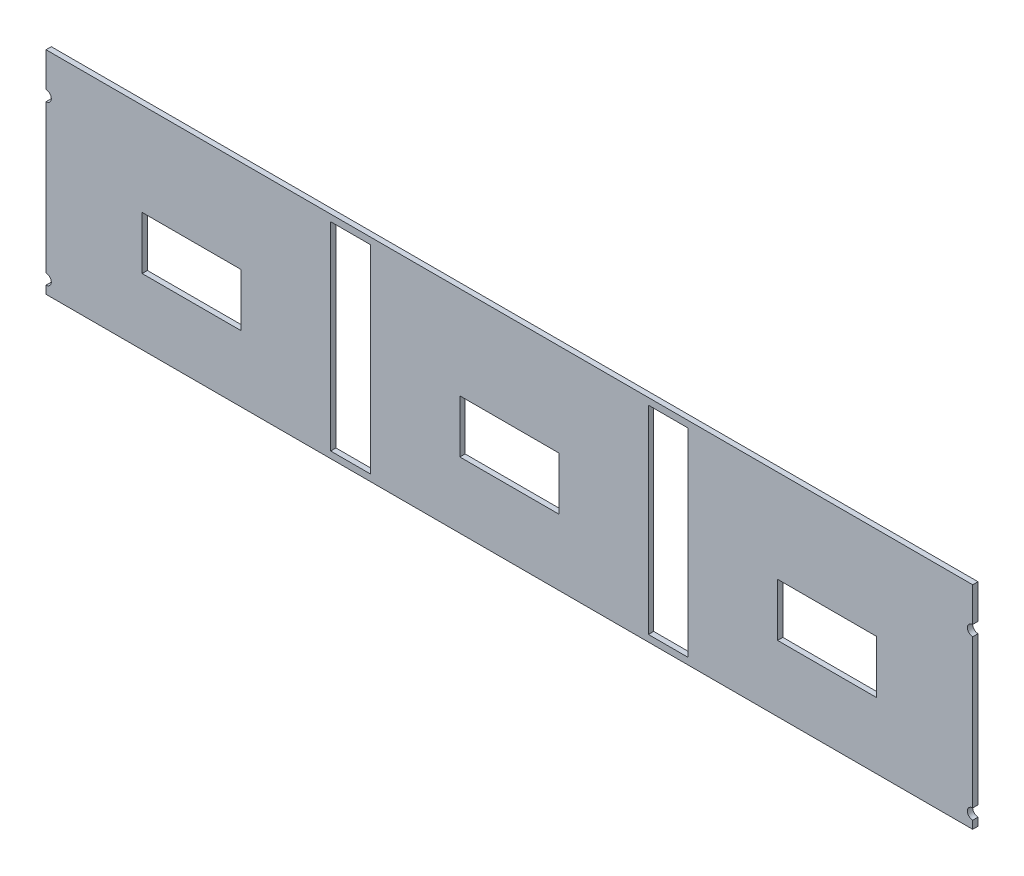
ISO-10303-21;
HEADER;
FILE_DESCRIPTION(('STEP AP214'),'2;1');
FILE_NAME('part.step','',(''),(''),'','','');
FILE_SCHEMA(('AUTOMOTIVE_DESIGN { 1 0 10303 214 1 1 1 1 }'));
ENDSEC;
DATA;
#1=APPLICATION_CONTEXT('core data for automotive mechanical design processes');
#2=APPLICATION_PROTOCOL_DEFINITION('international standard','automotive_design',2000,#1);
#3=PRODUCT_CONTEXT('',#1,'mechanical');
#4=PRODUCT('Part','Part','',(#3));
#5=PRODUCT_RELATED_PRODUCT_CATEGORY('part','',(#4));
#6=PRODUCT_DEFINITION_FORMATION('','',#4);
#7=PRODUCT_DEFINITION_CONTEXT('part definition',#1,'design');
#8=PRODUCT_DEFINITION('design','',#6,#7);
#9=PRODUCT_DEFINITION_SHAPE('','',#8);
#10=(LENGTH_UNIT() NAMED_UNIT(*) SI_UNIT(.MILLI.,.METRE.));
#11=(NAMED_UNIT(*) PLANE_ANGLE_UNIT() SI_UNIT($,.RADIAN.));
#12=(NAMED_UNIT(*) SI_UNIT($,.STERADIAN.) SOLID_ANGLE_UNIT());
#13=UNCERTAINTY_MEASURE_WITH_UNIT(LENGTH_MEASURE(1.E-05),#10,'distance_accuracy_value','');
#14=(GEOMETRIC_REPRESENTATION_CONTEXT(3) GLOBAL_UNCERTAINTY_ASSIGNED_CONTEXT((#13)) GLOBAL_UNIT_ASSIGNED_CONTEXT((#10,
#11,#12)) REPRESENTATION_CONTEXT('',''));
#15=CARTESIAN_POINT('',(0.,0.,0.));
#16=DIRECTION('',(0.,0.,1.));
#17=DIRECTION('',(1.,0.,0.));
#18=AXIS2_PLACEMENT_3D('',#15,#16,#17);
#19=CARTESIAN_POINT('',(-140.25891639578,36.8516824612227,2.54));
#20=DIRECTION('',(0.,1.,0.));
#21=DIRECTION('',(-1.,0.,0.));
#22=AXIS2_PLACEMENT_3D('',#19,#20,#21);
#23=PLANE('',#22);
#24=DIRECTION('',(1.,0.,0.));
#25=VECTOR('',#24,1.);
#26=CARTESIAN_POINT('',(-140.25891639578,36.8516824612227,0.));
#27=LINE('',#26,#25);
#28=CARTESIAN_POINT('',(-11.6079163957802,36.8516824612227,0.));
#29=VERTEX_POINT('',#28);
#30=CARTESIAN_POINT('',(35.8900836042198,36.8516824612227,0.));
#31=VERTEX_POINT('',#30);
#32=EDGE_CURVE('E351',#29,#31,#27,.T.);
#33=ORIENTED_EDGE('',*,*,#32,.T.);
#34=DIRECTION('',(0.,0.,-1.));
#35=VECTOR('',#34,1.);
#36=CARTESIAN_POINT('',(35.8900836042198,36.8516824612227,2.54));
#37=LINE('',#36,#35);
#38=CARTESIAN_POINT('',(35.8900836042198,36.8516824612227,2.54));
#39=VERTEX_POINT('',#38);
#40=EDGE_CURVE('E11',#39,#31,#37,.T.);
#41=ORIENTED_EDGE('',*,*,#40,.F.);
#42=DIRECTION('',(1.,0.,0.));
#43=VECTOR('',#42,1.);
#44=CARTESIAN_POINT('',(-140.25891639578,36.8516824612227,2.54));
#45=LINE('',#44,#43);
#46=CARTESIAN_POINT('',(-11.6079163957802,36.8516824612227,2.54));
#47=VERTEX_POINT('',#46);
#48=EDGE_CURVE('E259',#47,#39,#45,.T.);
#49=ORIENTED_EDGE('',*,*,#48,.F.);
#50=DIRECTION('',(0.,0.,-1.));
#51=VECTOR('',#50,1.);
#52=CARTESIAN_POINT('',(-11.6079163957802,36.8516824612227,2.54));
#53=LINE('',#52,#51);
#54=EDGE_CURVE('E54',#47,#29,#53,.T.);
#55=ORIENTED_EDGE('',*,*,#54,.T.);
#56=EDGE_LOOP('',(#33,#41,#49,#55));
#57=FACE_BOUND('',#56,.T.);
#58=ADVANCED_FACE('F35',(#57),#23,.F.);
#59=CARTESIAN_POINT('',(35.8900836042198,-389.181270146244,2.54));
#60=DIRECTION('',(1.,0.,0.));
#61=DIRECTION('',(0.,0.,-1.));
#62=AXIS2_PLACEMENT_3D('',#59,#60,#61);
#63=PLANE('',#62);
#64=DIRECTION('',(0.,-1.,0.));
#65=VECTOR('',#64,1.);
#66=CARTESIAN_POINT('',(35.8900836042198,-389.181270146244,0.));
#67=LINE('',#66,#65);
#68=CARTESIAN_POINT('',(35.8900836042198,11.4516824612227,0.));
#69=VERTEX_POINT('',#68);
#70=EDGE_CURVE('E265',#31,#69,#67,.T.);
#71=ORIENTED_EDGE('',*,*,#70,.T.);
#72=DIRECTION('',(0.,0.,-1.));
#73=VECTOR('',#72,1.);
#74=CARTESIAN_POINT('',(35.8900836042198,11.4516824612227,2.54));
#75=LINE('',#74,#73);
#76=CARTESIAN_POINT('',(35.8900836042198,11.4516824612227,2.54));
#77=VERTEX_POINT('',#76);
#78=EDGE_CURVE('E45',#77,#69,#75,.T.);
#79=ORIENTED_EDGE('',*,*,#78,.F.);
#80=DIRECTION('',(0.,-1.,0.));
#81=VECTOR('',#80,1.);
#82=CARTESIAN_POINT('',(35.8900836042198,-389.181270146244,2.54));
#83=LINE('',#82,#81);
#84=EDGE_CURVE('E253',#39,#77,#83,.T.);
#85=ORIENTED_EDGE('',*,*,#84,.F.);
#86=ORIENTED_EDGE('',*,*,#40,.T.);
#87=EDGE_LOOP('',(#71,#79,#85,#86));
#88=FACE_BOUND('',#87,.T.);
#89=ADVANCED_FACE('F264',(#88),#63,.F.);
#90=CARTESIAN_POINT('',(-140.25891639578,11.4516824612227,2.54));
#91=DIRECTION('',(0.,1.,0.));
#92=DIRECTION('',(0.,0.,1.));
#93=AXIS2_PLACEMENT_3D('',#90,#91,#92);
#94=PLANE('',#93);
#95=DIRECTION('',(1.,0.,0.));
#96=VECTOR('',#95,1.);
#97=CARTESIAN_POINT('',(-140.25891639578,11.4516824612227,0.));
#98=LINE('',#97,#96);
#99=CARTESIAN_POINT('',(-11.6079163957802,11.4516824612227,0.));
#100=VERTEX_POINT('',#99);
#101=EDGE_CURVE('E354',#100,#69,#98,.T.);
#102=ORIENTED_EDGE('',*,*,#101,.F.);
#103=DIRECTION('',(0.,0.,-1.));
#104=VECTOR('',#103,1.);
#105=CARTESIAN_POINT('',(-11.6079163957802,11.4516824612227,2.54));
#106=LINE('',#105,#104);
#107=CARTESIAN_POINT('',(-11.6079163957802,11.4516824612227,2.54));
#108=VERTEX_POINT('',#107);
#109=EDGE_CURVE('E152',#108,#100,#106,.T.);
#110=ORIENTED_EDGE('',*,*,#109,.F.);
#111=DIRECTION('',(1.,0.,0.));
#112=VECTOR('',#111,1.);
#113=CARTESIAN_POINT('',(-140.25891639578,11.4516824612227,2.54));
#114=LINE('',#113,#112);
#115=EDGE_CURVE('E258',#108,#77,#114,.T.);
#116=ORIENTED_EDGE('',*,*,#115,.T.);
#117=ORIENTED_EDGE('',*,*,#78,.T.);
#118=EDGE_LOOP('',(#102,#110,#116,#117));
#119=FACE_BOUND('',#118,.T.);
#120=ADVANCED_FACE('F269',(#119),#94,.T.);
#121=CARTESIAN_POINT('',(-140.25891639578,36.8516824612227,2.54));
#122=DIRECTION('',(0.,1.,0.));
#123=DIRECTION('',(-1.,0.,0.));
#124=AXIS2_PLACEMENT_3D('',#121,#122,#123);
#125=PLANE('',#124);
#126=DIRECTION('',(1.,0.,0.));
#127=VECTOR('',#126,1.);
#128=CARTESIAN_POINT('',(-140.25891639578,36.8516824612227,0.));
#129=LINE('',#128,#127);
#130=CARTESIAN_POINT('',(-164.00791639578,36.8516824612227,0.));
#131=VERTEX_POINT('',#130);
#132=CARTESIAN_POINT('',(-116.50991639578,36.8516824612227,0.));
#133=VERTEX_POINT('',#132);
#134=EDGE_CURVE('E339',#131,#133,#129,.T.);
#135=ORIENTED_EDGE('',*,*,#134,.T.);
#136=DIRECTION('',(0.,0.,-1.));
#137=VECTOR('',#136,1.);
#138=CARTESIAN_POINT('',(-116.50991639578,36.8516824612227,2.54));
#139=LINE('',#138,#137);
#140=CARTESIAN_POINT('',(-116.50991639578,36.8516824612227,2.54));
#141=VERTEX_POINT('',#140);
#142=EDGE_CURVE('E361',#141,#133,#139,.T.);
#143=ORIENTED_EDGE('',*,*,#142,.F.);
#144=DIRECTION('',(1.,0.,0.));
#145=VECTOR('',#144,1.);
#146=CARTESIAN_POINT('',(-140.25891639578,36.8516824612227,2.54));
#147=LINE('',#146,#145);
#148=CARTESIAN_POINT('',(-164.00791639578,36.8516824612227,2.54));
#149=VERTEX_POINT('',#148);
#150=EDGE_CURVE('E807',#149,#141,#147,.T.);
#151=ORIENTED_EDGE('',*,*,#150,.F.);
#152=DIRECTION('',(0.,0.,-1.));
#153=VECTOR('',#152,1.);
#154=CARTESIAN_POINT('',(-164.00791639578,36.8516824612227,2.54));
#155=LINE('',#154,#153);
#156=EDGE_CURVE('E363',#149,#131,#155,.T.);
#157=ORIENTED_EDGE('',*,*,#156,.T.);
#158=EDGE_LOOP('',(#135,#143,#151,#157));
#159=FACE_BOUND('',#158,.T.);
#160=ADVANCED_FACE('F463',(#159),#125,.F.);
#161=CARTESIAN_POINT('',(-116.50991639578,-389.181270146244,2.54));
#162=DIRECTION('',(1.,0.,0.));
#163=DIRECTION('',(0.,0.,-1.));
#164=AXIS2_PLACEMENT_3D('',#161,#162,#163);
#165=PLANE('',#164);
#166=DIRECTION('',(0.,-1.,0.));
#167=VECTOR('',#166,1.);
#168=CARTESIAN_POINT('',(-116.50991639578,-389.181270146244,0.));
#169=LINE('',#168,#167);
#170=CARTESIAN_POINT('',(-116.50991639578,11.4516824612227,0.));
#171=VERTEX_POINT('',#170);
#172=EDGE_CURVE('E342',#133,#171,#169,.T.);
#173=ORIENTED_EDGE('',*,*,#172,.T.);
#174=DIRECTION('',(0.,0.,-1.));
#175=VECTOR('',#174,1.);
#176=CARTESIAN_POINT('',(-116.50991639578,11.4516824612227,2.54));
#177=LINE('',#176,#175);
#178=CARTESIAN_POINT('',(-116.50991639578,11.4516824612227,2.54));
#179=VERTEX_POINT('',#178);
#180=EDGE_CURVE('E368',#179,#171,#177,.T.);
#181=ORIENTED_EDGE('',*,*,#180,.F.);
#182=DIRECTION('',(0.,-1.,0.));
#183=VECTOR('',#182,1.);
#184=CARTESIAN_POINT('',(-116.50991639578,-389.181270146244,2.54));
#185=LINE('',#184,#183);
#186=EDGE_CURVE('E810',#141,#179,#185,.T.);
#187=ORIENTED_EDGE('',*,*,#186,.F.);
#188=ORIENTED_EDGE('',*,*,#142,.T.);
#189=EDGE_LOOP('',(#173,#181,#187,#188));
#190=FACE_BOUND('',#189,.T.);
#191=ADVANCED_FACE('F459',(#190),#165,.F.);
#192=CARTESIAN_POINT('',(-140.25891639578,11.4516824612227,2.54));
#193=DIRECTION('',(0.,1.,0.));
#194=DIRECTION('',(0.,0.,1.));
#195=AXIS2_PLACEMENT_3D('',#192,#193,#194);
#196=PLANE('',#195);
#197=DIRECTION('',(1.,0.,0.));
#198=VECTOR('',#197,1.);
#199=CARTESIAN_POINT('',(-140.25891639578,11.4516824612227,0.));
#200=LINE('',#199,#198);
#201=CARTESIAN_POINT('',(-164.00791639578,11.4516824612227,0.));
#202=VERTEX_POINT('',#201);
#203=EDGE_CURVE('E345',#202,#171,#200,.T.);
#204=ORIENTED_EDGE('',*,*,#203,.F.);
#205=DIRECTION('',(0.,0.,-1.));
#206=VECTOR('',#205,1.);
#207=CARTESIAN_POINT('',(-164.00791639578,11.4516824612227,2.54));
#208=LINE('',#207,#206);
#209=CARTESIAN_POINT('',(-164.00791639578,11.4516824612227,2.54));
#210=VERTEX_POINT('',#209);
#211=EDGE_CURVE('E365',#210,#202,#208,.T.);
#212=ORIENTED_EDGE('',*,*,#211,.F.);
#213=DIRECTION('',(1.,0.,0.));
#214=VECTOR('',#213,1.);
#215=CARTESIAN_POINT('',(-140.25891639578,11.4516824612227,2.54));
#216=LINE('',#215,#214);
#217=EDGE_CURVE('E812',#210,#179,#216,.T.);
#218=ORIENTED_EDGE('',*,*,#217,.T.);
#219=ORIENTED_EDGE('',*,*,#180,.T.);
#220=EDGE_LOOP('',(#204,#212,#218,#219));
#221=FACE_BOUND('',#220,.T.);
#222=ADVANCED_FACE('F455',(#221),#196,.T.);
#223=CARTESIAN_POINT('',(-206.93391639578,-389.181270146244,2.54));
#224=DIRECTION('',(1.,0.,0.));
#225=DIRECTION('',(0.,0.,-1.));
#226=AXIS2_PLACEMENT_3D('',#223,#224,#225);
#227=PLANE('',#226);
#228=DIRECTION('',(0.,-1.,0.));
#229=VECTOR('',#228,1.);
#230=CARTESIAN_POINT('',(-206.93391639578,-389.181270146244,0.));
#231=LINE('',#230,#229);
#232=CARTESIAN_POINT('',(-206.93391639578,78.1952624612227,0.));
#233=VERTEX_POINT('',#232);
#234=CARTESIAN_POINT('',(-206.93391639578,-17.0547375387773,0.));
#235=VERTEX_POINT('',#234);
#236=EDGE_CURVE('E328',#233,#235,#231,.T.);
#237=ORIENTED_EDGE('',*,*,#236,.T.);
#238=DIRECTION('',(0.,0.,-1.));
#239=VECTOR('',#238,1.);
#240=CARTESIAN_POINT('',(-206.93391639578,-17.0547375387773,2.54));
#241=LINE('',#240,#239);
#242=CARTESIAN_POINT('',(-206.93391639578,-17.0547375387773,2.54));
#243=VERTEX_POINT('',#242);
#244=EDGE_CURVE('E366',#243,#235,#241,.T.);
#245=ORIENTED_EDGE('',*,*,#244,.F.);
#246=DIRECTION('',(0.,-1.,0.));
#247=VECTOR('',#246,1.);
#248=CARTESIAN_POINT('',(-206.93391639578,-389.181270146244,2.54));
#249=LINE('',#248,#247);
#250=CARTESIAN_POINT('',(-206.93391639578,78.1952624612227,2.54));
#251=VERTEX_POINT('',#250);
#252=EDGE_CURVE('E797',#251,#243,#249,.T.);
#253=ORIENTED_EDGE('',*,*,#252,.F.);
#254=DIRECTION('',(0.,0.,-1.));
#255=VECTOR('',#254,1.);
#256=CARTESIAN_POINT('',(-206.93391639578,78.1952624612227,2.54));
#257=LINE('',#256,#255);
#258=EDGE_CURVE('E372',#251,#233,#257,.T.);
#259=ORIENTED_EDGE('',*,*,#258,.T.);
#260=EDGE_LOOP('',(#237,#245,#253,#259));
#261=FACE_BOUND('',#260,.T.);
#262=ADVANCED_FACE('F458',(#261),#227,.F.);
#263=CARTESIAN_POINT('',(-140.25891639578,-17.0547375387773,2.54));
#264=DIRECTION('',(0.,1.,0.));
#265=DIRECTION('',(0.,0.,1.));
#266=AXIS2_PLACEMENT_3D('',#263,#264,#265);
#267=PLANE('',#266);
#268=DIRECTION('',(1.,0.,0.));
#269=VECTOR('',#268,1.);
#270=CARTESIAN_POINT('',(-140.25891639578,-17.0547375387773,0.));
#271=LINE('',#270,#269);
#272=CARTESIAN_POINT('',(-225.98391639578,-17.0547375387773,0.));
#273=VERTEX_POINT('',#272);
#274=EDGE_CURVE('E331',#273,#235,#271,.T.);
#275=ORIENTED_EDGE('',*,*,#274,.F.);
#276=DIRECTION('',(0.,0.,-1.));
#277=VECTOR('',#276,1.);
#278=CARTESIAN_POINT('',(-225.98391639578,-17.0547375387773,2.54));
#279=LINE('',#278,#277);
#280=CARTESIAN_POINT('',(-225.98391639578,-17.0547375387773,2.54));
#281=VERTEX_POINT('',#280);
#282=EDGE_CURVE('E378',#281,#273,#279,.T.);
#283=ORIENTED_EDGE('',*,*,#282,.F.);
#284=DIRECTION('',(1.,0.,0.));
#285=VECTOR('',#284,1.);
#286=CARTESIAN_POINT('',(-140.25891639578,-17.0547375387773,2.54));
#287=LINE('',#286,#285);
#288=EDGE_CURVE('E799',#281,#243,#287,.T.);
#289=ORIENTED_EDGE('',*,*,#288,.T.);
#290=ORIENTED_EDGE('',*,*,#244,.T.);
#291=EDGE_LOOP('',(#275,#283,#289,#290));
#292=FACE_BOUND('',#291,.T.);
#293=ADVANCED_FACE('F476',(#292),#267,.T.);
#294=CARTESIAN_POINT('',(-225.98391639578,-389.181270146244,2.54));
#295=DIRECTION('',(1.,0.,0.));
#296=DIRECTION('',(0.,1.,0.));
#297=AXIS2_PLACEMENT_3D('',#294,#295,#296);
#298=PLANE('',#297);
#299=DIRECTION('',(0.,-1.,0.));
#300=VECTOR('',#299,1.);
#301=CARTESIAN_POINT('',(-225.98391639578,-389.181270146244,0.));
#302=LINE('',#301,#300);
#303=CARTESIAN_POINT('',(-225.98391639578,78.1952624612227,0.));
#304=VERTEX_POINT('',#303);
#305=EDGE_CURVE('E334',#304,#273,#302,.T.);
#306=ORIENTED_EDGE('',*,*,#305,.F.);
#307=DIRECTION('',(0.,0.,-1.));
#308=VECTOR('',#307,1.);
#309=CARTESIAN_POINT('',(-225.98391639578,78.1952624612227,2.54));
#310=LINE('',#309,#308);
#311=CARTESIAN_POINT('',(-225.98391639578,78.1952624612227,2.54));
#312=VERTEX_POINT('',#311);
#313=EDGE_CURVE('E375',#312,#304,#310,.T.);
#314=ORIENTED_EDGE('',*,*,#313,.F.);
#315=DIRECTION('',(0.,-1.,0.));
#316=VECTOR('',#315,1.);
#317=CARTESIAN_POINT('',(-225.98391639578,-389.181270146244,2.54));
#318=LINE('',#317,#316);
#319=EDGE_CURVE('E802',#312,#281,#318,.T.);
#320=ORIENTED_EDGE('',*,*,#319,.T.);
#321=ORIENTED_EDGE('',*,*,#282,.T.);
#322=EDGE_LOOP('',(#306,#314,#320,#321));
#323=FACE_BOUND('',#322,.T.);
#324=ADVANCED_FACE('F472',(#323),#298,.T.);
#325=CARTESIAN_POINT('',(-140.25891639578,36.8516824612227,2.54));
#326=DIRECTION('',(0.,1.,0.));
#327=DIRECTION('',(-1.,0.,0.));
#328=AXIS2_PLACEMENT_3D('',#325,#326,#327);
#329=PLANE('',#328);
#330=DIRECTION('',(1.,0.,0.));
#331=VECTOR('',#330,1.);
#332=CARTESIAN_POINT('',(-140.25891639578,36.8516824612227,0.));
#333=LINE('',#332,#331);
#334=CARTESIAN_POINT('',(-316.40791639578,36.8516824612228,0.));
#335=VERTEX_POINT('',#334);
#336=CARTESIAN_POINT('',(-268.90991639578,36.8516824612227,0.));
#337=VERTEX_POINT('',#336);
#338=EDGE_CURVE('E316',#335,#337,#333,.T.);
#339=ORIENTED_EDGE('',*,*,#338,.T.);
#340=DIRECTION('',(0.,0.,-1.));
#341=VECTOR('',#340,1.);
#342=CARTESIAN_POINT('',(-268.90991639578,36.8516824612227,2.54));
#343=LINE('',#342,#341);
#344=CARTESIAN_POINT('',(-268.90991639578,36.8516824612227,2.54));
#345=VERTEX_POINT('',#344);
#346=EDGE_CURVE('E376',#345,#337,#343,.T.);
#347=ORIENTED_EDGE('',*,*,#346,.F.);
#348=DIRECTION('',(1.,0.,0.));
#349=VECTOR('',#348,1.);
#350=CARTESIAN_POINT('',(-140.25891639578,36.8516824612227,2.54));
#351=LINE('',#350,#349);
#352=CARTESIAN_POINT('',(-316.40791639578,36.8516824612228,2.54));
#353=VERTEX_POINT('',#352);
#354=EDGE_CURVE('E781',#353,#345,#351,.T.);
#355=ORIENTED_EDGE('',*,*,#354,.F.);
#356=DIRECTION('',(0.,0.,-1.));
#357=VECTOR('',#356,1.);
#358=CARTESIAN_POINT('',(-316.40791639578,36.8516824612228,2.54));
#359=LINE('',#358,#357);
#360=EDGE_CURVE('E381',#353,#335,#359,.T.);
#361=ORIENTED_EDGE('',*,*,#360,.T.);
#362=EDGE_LOOP('',(#339,#347,#355,#361));
#363=FACE_BOUND('',#362,.T.);
#364=ADVANCED_FACE('F475',(#363),#329,.F.);
#365=CARTESIAN_POINT('',(-268.90991639578,-389.181270146244,2.54));
#366=DIRECTION('',(1.,0.,0.));
#367=DIRECTION('',(0.,0.,-1.));
#368=AXIS2_PLACEMENT_3D('',#365,#366,#367);
#369=PLANE('',#368);
#370=DIRECTION('',(0.,-1.,0.));
#371=VECTOR('',#370,1.);
#372=CARTESIAN_POINT('',(-268.90991639578,-389.181270146244,0.));
#373=LINE('',#372,#371);
#374=CARTESIAN_POINT('',(-268.90991639578,11.4516824612227,0.));
#375=VERTEX_POINT('',#374);
#376=EDGE_CURVE('E319',#337,#375,#373,.T.);
#377=ORIENTED_EDGE('',*,*,#376,.T.);
#378=DIRECTION('',(0.,0.,-1.));
#379=VECTOR('',#378,1.);
#380=CARTESIAN_POINT('',(-268.90991639578,11.4516824612227,2.54));
#381=LINE('',#380,#379);
#382=CARTESIAN_POINT('',(-268.90991639578,11.4516824612227,2.54));
#383=VERTEX_POINT('',#382);
#384=EDGE_CURVE('E386',#383,#375,#381,.T.);
#385=ORIENTED_EDGE('',*,*,#384,.F.);
#386=DIRECTION('',(0.,-1.,0.));
#387=VECTOR('',#386,1.);
#388=CARTESIAN_POINT('',(-268.90991639578,-389.181270146244,2.54));
#389=LINE('',#388,#387);
#390=EDGE_CURVE('E789',#345,#383,#389,.T.);
#391=ORIENTED_EDGE('',*,*,#390,.F.);
#392=ORIENTED_EDGE('',*,*,#346,.T.);
#393=EDGE_LOOP('',(#377,#385,#391,#392));
#394=FACE_BOUND('',#393,.T.);
#395=ADVANCED_FACE('F492',(#394),#369,.F.);
#396=CARTESIAN_POINT('',(-140.25891639578,11.4516824612227,2.54));
#397=DIRECTION('',(0.,1.,0.));
#398=DIRECTION('',(0.,0.,1.));
#399=AXIS2_PLACEMENT_3D('',#396,#397,#398);
#400=PLANE('',#399);
#401=DIRECTION('',(1.,0.,0.));
#402=VECTOR('',#401,1.);
#403=CARTESIAN_POINT('',(-140.25891639578,11.4516824612227,0.));
#404=LINE('',#403,#402);
#405=CARTESIAN_POINT('',(-316.40791639578,11.4516824612227,0.));
#406=VERTEX_POINT('',#405);
#407=EDGE_CURVE('E322',#406,#375,#404,.T.);
#408=ORIENTED_EDGE('',*,*,#407,.F.);
#409=DIRECTION('',(0.,0.,-1.));
#410=VECTOR('',#409,1.);
#411=CARTESIAN_POINT('',(-316.40791639578,11.4516824612227,2.54));
#412=LINE('',#411,#410);
#413=CARTESIAN_POINT('',(-316.40791639578,11.4516824612227,2.54));
#414=VERTEX_POINT('',#413);
#415=EDGE_CURVE('E383',#414,#406,#412,.T.);
#416=ORIENTED_EDGE('',*,*,#415,.F.);
#417=DIRECTION('',(1.,0.,0.));
#418=VECTOR('',#417,1.);
#419=CARTESIAN_POINT('',(-140.25891639578,11.4516824612227,2.54));
#420=LINE('',#419,#418);
#421=EDGE_CURVE('E791',#414,#383,#420,.T.);
#422=ORIENTED_EDGE('',*,*,#421,.T.);
#423=ORIENTED_EDGE('',*,*,#384,.T.);
#424=EDGE_LOOP('',(#408,#416,#422,#423));
#425=FACE_BOUND('',#424,.T.);
#426=ADVANCED_FACE('F488',(#425),#400,.T.);
#427=CARTESIAN_POINT('',(-140.25891639578,-20.2297375387773,2.54));
#428=DIRECTION('',(0.,1.,0.));
#429=DIRECTION('',(-1.,0.,0.));
#430=AXIS2_PLACEMENT_3D('',#427,#428,#429);
#431=PLANE('',#430);
#432=DIRECTION('',(1.,0.,0.));
#433=VECTOR('',#432,1.);
#434=CARTESIAN_POINT('',(-140.25891639578,-20.2297375387773,0.));
#435=LINE('',#434,#433);
#436=CARTESIAN_POINT('',(-362.50891639578,-20.2297375387773,0.));
#437=VERTEX_POINT('',#436);
#438=CARTESIAN_POINT('',(81.9910836042198,-20.2297375387773,0.));
#439=VERTEX_POINT('',#438);
#440=EDGE_CURVE('E288',#437,#439,#435,.T.);
#441=ORIENTED_EDGE('',*,*,#440,.T.);
#442=DIRECTION('',(0.,0.,-1.));
#443=VECTOR('',#442,1.);
#444=CARTESIAN_POINT('',(81.9910836042198,-20.2297375387773,2.54));
#445=LINE('',#444,#443);
#446=CARTESIAN_POINT('',(81.9910836042198,-20.2297375387773,2.54));
#447=VERTEX_POINT('',#446);
#448=EDGE_CURVE('E384',#447,#439,#445,.T.);
#449=ORIENTED_EDGE('',*,*,#448,.F.);
#450=DIRECTION('',(1.,0.,0.));
#451=VECTOR('',#450,1.);
#452=CARTESIAN_POINT('',(-140.25891639578,-20.2297375387773,2.54));
#453=LINE('',#452,#451);
#454=CARTESIAN_POINT('',(-362.50891639578,-20.2297375387773,2.54));
#455=VERTEX_POINT('',#454);
#456=EDGE_CURVE('E865',#455,#447,#453,.T.);
#457=ORIENTED_EDGE('',*,*,#456,.F.);
#458=DIRECTION('',(0.,0.,-1.));
#459=VECTOR('',#458,1.);
#460=CARTESIAN_POINT('',(-362.50891639578,-20.2297375387773,2.54));
#461=LINE('',#460,#459);
#462=EDGE_CURVE('E390',#455,#437,#461,.T.);
#463=ORIENTED_EDGE('',*,*,#462,.T.);
#464=EDGE_LOOP('',(#441,#449,#457,#463));
#465=FACE_BOUND('',#464,.T.);
#466=ADVANCED_FACE('F491',(#465),#431,.F.);
#467=CARTESIAN_POINT('',(81.9910836042198,-389.181270146244,2.54));
#468=DIRECTION('',(1.,0.,0.));
#469=DIRECTION('',(0.,1.,0.));
#470=AXIS2_PLACEMENT_3D('',#467,#468,#469);
#471=PLANE('',#470);
#472=DIRECTION('',(0.,-1.,0.));
#473=VECTOR('',#472,1.);
#474=CARTESIAN_POINT('',(81.9910836042198,-389.181270146244,0.));
#475=LINE('',#474,#473);
#476=CARTESIAN_POINT('',(81.9910836042198,-16.4197375387773,0.));
#477=VERTEX_POINT('',#476);
#478=EDGE_CURVE('E291',#477,#439,#475,.T.);
#479=ORIENTED_EDGE('',*,*,#478,.F.);
#480=DIRECTION('',(0.,0.,-1.));
#481=VECTOR('',#480,1.);
#482=CARTESIAN_POINT('',(81.9910836042198,-16.4197375387773,2.54));
#483=LINE('',#482,#481);
#484=CARTESIAN_POINT('',(81.9910836042198,-16.4197375387773,2.54));
#485=VERTEX_POINT('',#484);
#486=EDGE_CURVE('E411',#485,#477,#483,.T.);
#487=ORIENTED_EDGE('',*,*,#486,.F.);
#488=DIRECTION('',(0.,-1.,0.));
#489=VECTOR('',#488,1.);
#490=CARTESIAN_POINT('',(81.9910836042198,-389.181270146244,2.54));
#491=LINE('',#490,#489);
#492=EDGE_CURVE('E862',#485,#447,#491,.T.);
#493=ORIENTED_EDGE('',*,*,#492,.T.);
#494=ORIENTED_EDGE('',*,*,#448,.T.);
#495=EDGE_LOOP('',(#479,#487,#493,#494));
#496=FACE_BOUND('',#495,.T.);
#497=ADVANCED_FACE('F522',(#496),#471,.T.);
#498=CARTESIAN_POINT('',(81.9910836042197,-13.8797375387773,2.54));
#499=DIRECTION('',(0.,0.,-1.));
#500=DIRECTION('',(-1.,0.,0.));
#501=AXIS2_PLACEMENT_3D('',#498,#499,#500);
#502=CYLINDRICAL_SURFACE('',#501,2.54);
#503=CARTESIAN_POINT('',(81.9910836042197,-13.8797375387773,0.));
#504=DIRECTION('',(0.,0.,1.));
#505=DIRECTION('',(1.,0.,0.));
#506=AXIS2_PLACEMENT_3D('',#503,#504,#505);
#507=CIRCLE('',#506,2.54);
#508=CARTESIAN_POINT('',(81.9910836042198,-11.3397375387773,0.));
#509=VERTEX_POINT('',#508);
#510=EDGE_CURVE('E294',#509,#477,#507,.T.);
#511=ORIENTED_EDGE('',*,*,#510,.F.);
#512=DIRECTION('',(0.,0.,-1.));
#513=VECTOR('',#512,1.);
#514=CARTESIAN_POINT('',(81.9910836042198,-11.3397375387773,2.54));
#515=LINE('',#514,#513);
#516=CARTESIAN_POINT('',(81.9910836042198,-11.3397375387773,2.54));
#517=VERTEX_POINT('',#516);
#518=EDGE_CURVE('E409',#517,#509,#515,.T.);
#519=ORIENTED_EDGE('',*,*,#518,.F.);
#520=CARTESIAN_POINT('',(81.9910836042197,-13.8797375387773,2.54));
#521=DIRECTION('',(0.,0.,1.));
#522=DIRECTION('',(1.,0.,0.));
#523=AXIS2_PLACEMENT_3D('',#520,#521,#522);
#524=CIRCLE('',#523,2.54);
#525=EDGE_CURVE('E859',#517,#485,#524,.T.);
#526=ORIENTED_EDGE('',*,*,#525,.T.);
#527=ORIENTED_EDGE('',*,*,#486,.T.);
#528=EDGE_LOOP('',(#511,#519,#526,#527));
#529=FACE_BOUND('',#528,.T.);
#530=ADVANCED_FACE('F527',(#529),#502,.F.);
#531=CARTESIAN_POINT('',(81.9910836042198,59.7802624612227,0.));
#532=VERTEX_POINT('',#531);
#533=EDGE_CURVE('E296',#532,#509,#475,.T.);
#534=ORIENTED_EDGE('',*,*,#533,.F.);
#535=DIRECTION('',(0.,0.,-1.));
#536=VECTOR('',#535,1.);
#537=CARTESIAN_POINT('',(81.9910836042198,59.7802624612227,2.54));
#538=LINE('',#537,#536);
#539=CARTESIAN_POINT('',(81.9910836042198,59.7802624612227,2.54));
#540=VERTEX_POINT('',#539);
#541=EDGE_CURVE('E407',#540,#532,#538,.T.);
#542=ORIENTED_EDGE('',*,*,#541,.F.);
#543=EDGE_CURVE('E858',#540,#517,#491,.T.);
#544=ORIENTED_EDGE('',*,*,#543,.T.);
#545=ORIENTED_EDGE('',*,*,#518,.T.);
#546=EDGE_LOOP('',(#534,#542,#544,#545));
#547=FACE_BOUND('',#546,.T.);
#548=ADVANCED_FACE('F523',(#547),#471,.T.);
#549=CARTESIAN_POINT('',(81.9910836042197,62.3202624612227,2.54));
#550=DIRECTION('',(0.,0.,-1.));
#551=DIRECTION('',(-1.,0.,0.));
#552=AXIS2_PLACEMENT_3D('',#549,#550,#551);
#553=CYLINDRICAL_SURFACE('',#552,2.53999999999999);
#554=CARTESIAN_POINT('',(81.9910836042197,62.3202624612227,0.));
#555=DIRECTION('',(0.,0.,1.));
#556=DIRECTION('',(1.,0.,0.));
#557=AXIS2_PLACEMENT_3D('',#554,#555,#556);
#558=CIRCLE('',#557,2.53999999999999);
#559=CARTESIAN_POINT('',(81.9910836042198,64.8602624612227,0.));
#560=VERTEX_POINT('',#559);
#561=EDGE_CURVE('E299',#560,#532,#558,.T.);
#562=ORIENTED_EDGE('',*,*,#561,.F.);
#563=DIRECTION('',(0.,0.,-1.));
#564=VECTOR('',#563,1.);
#565=CARTESIAN_POINT('',(81.9910836042198,64.8602624612227,2.54));
#566=LINE('',#565,#564);
#567=CARTESIAN_POINT('',(81.9910836042198,64.8602624612227,2.54));
#568=VERTEX_POINT('',#567);
#569=EDGE_CURVE('E405',#568,#560,#566,.T.);
#570=ORIENTED_EDGE('',*,*,#569,.F.);
#571=CARTESIAN_POINT('',(81.9910836042197,62.3202624612227,2.54));
#572=DIRECTION('',(0.,0.,1.));
#573=DIRECTION('',(1.,0.,0.));
#574=AXIS2_PLACEMENT_3D('',#571,#572,#573);
#575=CIRCLE('',#574,2.53999999999999);
#576=EDGE_CURVE('E855',#568,#540,#575,.T.);
#577=ORIENTED_EDGE('',*,*,#576,.T.);
#578=ORIENTED_EDGE('',*,*,#541,.T.);
#579=EDGE_LOOP('',(#562,#570,#577,#578));
#580=FACE_BOUND('',#579,.T.);
#581=ADVANCED_FACE('F520',(#580),#553,.F.);
#582=CARTESIAN_POINT('',(81.9910836042198,81.3702624612228,0.));
#583=VERTEX_POINT('',#582);
#584=EDGE_CURVE('E295',#583,#560,#475,.T.);
#585=ORIENTED_EDGE('',*,*,#584,.F.);
#586=DIRECTION('',(0.,0.,-1.));
#587=VECTOR('',#586,1.);
#588=CARTESIAN_POINT('',(81.9910836042198,81.3702624612228,2.54));
#589=LINE('',#588,#587);
#590=CARTESIAN_POINT('',(81.9910836042198,81.3702624612228,2.54));
#591=VERTEX_POINT('',#590);
#592=EDGE_CURVE('E403',#591,#583,#589,.T.);
#593=ORIENTED_EDGE('',*,*,#592,.F.);
#594=EDGE_CURVE('E854',#591,#568,#491,.T.);
#595=ORIENTED_EDGE('',*,*,#594,.T.);
#596=ORIENTED_EDGE('',*,*,#569,.T.);
#597=EDGE_LOOP('',(#585,#593,#595,#596));
#598=FACE_BOUND('',#597,.T.);
#599=ADVANCED_FACE('F516',(#598),#471,.T.);
#600=CARTESIAN_POINT('',(-140.25891639578,81.3702624612228,2.54));
#601=DIRECTION('',(0.,1.,0.));
#602=DIRECTION('',(0.,0.,1.));
#603=AXIS2_PLACEMENT_3D('',#600,#601,#602);
#604=PLANE('',#603);
#605=DIRECTION('',(1.,0.,0.));
#606=VECTOR('',#605,1.);
#607=CARTESIAN_POINT('',(-140.25891639578,81.3702624612228,0.));
#608=LINE('',#607,#606);
#609=CARTESIAN_POINT('',(-362.50891639578,81.3702624612228,0.));
#610=VERTEX_POINT('',#609);
#611=EDGE_CURVE('E302',#610,#583,#608,.T.);
#612=ORIENTED_EDGE('',*,*,#611,.F.);
#613=DIRECTION('',(0.,0.,-1.));
#614=VECTOR('',#613,1.);
#615=CARTESIAN_POINT('',(-362.50891639578,81.3702624612228,2.54));
#616=LINE('',#615,#614);
#617=CARTESIAN_POINT('',(-362.50891639578,81.3702624612228,2.54));
#618=VERTEX_POINT('',#617);
#619=EDGE_CURVE('E401',#618,#610,#616,.T.);
#620=ORIENTED_EDGE('',*,*,#619,.F.);
#621=DIRECTION('',(1.,0.,0.));
#622=VECTOR('',#621,1.);
#623=CARTESIAN_POINT('',(-140.25891639578,81.3702624612228,2.54));
#624=LINE('',#623,#622);
#625=EDGE_CURVE('E851',#618,#591,#624,.T.);
#626=ORIENTED_EDGE('',*,*,#625,.T.);
#627=ORIENTED_EDGE('',*,*,#592,.T.);
#628=EDGE_LOOP('',(#612,#620,#626,#627));
#629=FACE_BOUND('',#628,.T.);
#630=ADVANCED_FACE('F513',(#629),#604,.T.);
#631=CARTESIAN_POINT('',(-362.50891639578,-389.181270146244,2.54));
#632=DIRECTION('',(1.,0.,0.));
#633=DIRECTION('',(0.,0.,-1.));
#634=AXIS2_PLACEMENT_3D('',#631,#632,#633);
#635=PLANE('',#634);
#636=DIRECTION('',(0.,-1.,0.));
#637=VECTOR('',#636,1.);
#638=CARTESIAN_POINT('',(-362.50891639578,-389.181270146244,0.));
#639=LINE('',#638,#637);
#640=CARTESIAN_POINT('',(-362.50891639578,64.8602624612227,0.));
#641=VERTEX_POINT('',#640);
#642=EDGE_CURVE('E305',#610,#641,#639,.T.);
#643=ORIENTED_EDGE('',*,*,#642,.T.);
#644=DIRECTION('',(0.,0.,-1.));
#645=VECTOR('',#644,1.);
#646=CARTESIAN_POINT('',(-362.50891639578,64.8602624612227,2.54));
#647=LINE('',#646,#645);
#648=CARTESIAN_POINT('',(-362.50891639578,64.8602624612227,2.54));
#649=VERTEX_POINT('',#648);
#650=EDGE_CURVE('E399',#649,#641,#647,.T.);
#651=ORIENTED_EDGE('',*,*,#650,.F.);
#652=DIRECTION('',(0.,-1.,0.));
#653=VECTOR('',#652,1.);
#654=CARTESIAN_POINT('',(-362.50891639578,-389.181270146244,2.54));
#655=LINE('',#654,#653);
#656=EDGE_CURVE('E783',#618,#649,#655,.T.);
#657=ORIENTED_EDGE('',*,*,#656,.F.);
#658=ORIENTED_EDGE('',*,*,#619,.T.);
#659=EDGE_LOOP('',(#643,#651,#657,#658));
#660=FACE_BOUND('',#659,.T.);
#661=ADVANCED_FACE('F503',(#660),#635,.F.);
#662=CARTESIAN_POINT('',(-362.50891639578,62.3202624612227,2.54));
#663=DIRECTION('',(0.,0.,-1.));
#664=DIRECTION('',(-1.,0.,0.));
#665=AXIS2_PLACEMENT_3D('',#662,#663,#664);
#666=CYLINDRICAL_SURFACE('',#665,2.54000000000001);
#667=CARTESIAN_POINT('',(-362.50891639578,62.3202624612227,0.));
#668=DIRECTION('',(0.,0.,1.));
#669=DIRECTION('',(1.,0.,0.));
#670=AXIS2_PLACEMENT_3D('',#667,#668,#669);
#671=CIRCLE('',#670,2.54000000000001);
#672=CARTESIAN_POINT('',(-362.50891639578,59.7802624612227,0.));
#673=VERTEX_POINT('',#672);
#674=EDGE_CURVE('E308',#673,#641,#671,.T.);
#675=ORIENTED_EDGE('',*,*,#674,.F.);
#676=DIRECTION('',(0.,0.,-1.));
#677=VECTOR('',#676,1.);
#678=CARTESIAN_POINT('',(-362.50891639578,59.7802624612227,2.54));
#679=LINE('',#678,#677);
#680=CARTESIAN_POINT('',(-362.50891639578,59.7802624612227,2.54));
#681=VERTEX_POINT('',#680);
#682=EDGE_CURVE('E397',#681,#673,#679,.T.);
#683=ORIENTED_EDGE('',*,*,#682,.F.);
#684=CARTESIAN_POINT('',(-362.50891639578,62.3202624612227,2.54));
#685=DIRECTION('',(0.,0.,1.));
#686=DIRECTION('',(1.,0.,0.));
#687=AXIS2_PLACEMENT_3D('',#684,#685,#686);
#688=CIRCLE('',#687,2.54000000000001);
#689=EDGE_CURVE('E784',#681,#649,#688,.T.);
#690=ORIENTED_EDGE('',*,*,#689,.T.);
#691=ORIENTED_EDGE('',*,*,#650,.T.);
#692=EDGE_LOOP('',(#675,#683,#690,#691));
#693=FACE_BOUND('',#692,.T.);
#694=ADVANCED_FACE('F509',(#693),#666,.F.);
#695=CARTESIAN_POINT('',(-362.50891639578,-11.3397375387773,0.));
#696=VERTEX_POINT('',#695);
#697=EDGE_CURVE('E310',#673,#696,#639,.T.);
#698=ORIENTED_EDGE('',*,*,#697,.T.);
#699=DIRECTION('',(0.,0.,-1.));
#700=VECTOR('',#699,1.);
#701=CARTESIAN_POINT('',(-362.50891639578,-11.3397375387773,2.54));
#702=LINE('',#701,#700);
#703=CARTESIAN_POINT('',(-362.50891639578,-11.3397375387773,2.54));
#704=VERTEX_POINT('',#703);
#705=EDGE_CURVE('E395',#704,#696,#702,.T.);
#706=ORIENTED_EDGE('',*,*,#705,.F.);
#707=EDGE_CURVE('E779',#681,#704,#655,.T.);
#708=ORIENTED_EDGE('',*,*,#707,.F.);
#709=ORIENTED_EDGE('',*,*,#682,.T.);
#710=EDGE_LOOP('',(#698,#706,#708,#709));
#711=FACE_BOUND('',#710,.T.);
#712=ADVANCED_FACE('F504',(#711),#635,.F.);
#713=CARTESIAN_POINT('',(-362.50891639578,-13.8797375387773,2.54));
#714=DIRECTION('',(0.,0.,-1.));
#715=DIRECTION('',(-1.,0.,0.));
#716=AXIS2_PLACEMENT_3D('',#713,#714,#715);
#717=CYLINDRICAL_SURFACE('',#716,2.54000000000001);
#718=CARTESIAN_POINT('',(-362.50891639578,-13.8797375387773,0.));
#719=DIRECTION('',(0.,0.,1.));
#720=DIRECTION('',(1.,0.,0.));
#721=AXIS2_PLACEMENT_3D('',#718,#719,#720);
#722=CIRCLE('',#721,2.54000000000001);
#723=CARTESIAN_POINT('',(-362.50891639578,-16.4197375387773,0.));
#724=VERTEX_POINT('',#723);
#725=EDGE_CURVE('E313',#724,#696,#722,.T.);
#726=ORIENTED_EDGE('',*,*,#725,.F.);
#727=DIRECTION('',(0.,0.,-1.));
#728=VECTOR('',#727,1.);
#729=CARTESIAN_POINT('',(-362.50891639578,-16.4197375387773,2.54));
#730=LINE('',#729,#728);
#731=CARTESIAN_POINT('',(-362.50891639578,-16.4197375387773,2.54));
#732=VERTEX_POINT('',#731);
#733=EDGE_CURVE('E393',#732,#724,#730,.T.);
#734=ORIENTED_EDGE('',*,*,#733,.F.);
#735=CARTESIAN_POINT('',(-362.50891639578,-13.8797375387773,2.54));
#736=DIRECTION('',(0.,0.,1.));
#737=DIRECTION('',(1.,0.,0.));
#738=AXIS2_PLACEMENT_3D('',#735,#736,#737);
#739=CIRCLE('',#738,2.54000000000001);
#740=EDGE_CURVE('E776',#732,#704,#739,.T.);
#741=ORIENTED_EDGE('',*,*,#740,.T.);
#742=ORIENTED_EDGE('',*,*,#705,.T.);
#743=EDGE_LOOP('',(#726,#734,#741,#742));
#744=FACE_BOUND('',#743,.T.);
#745=ADVANCED_FACE('F505',(#744),#717,.F.);
#746=CARTESIAN_POINT('',(-140.25891639578,78.1952624612227,2.54));
#747=DIRECTION('',(0.,1.,0.));
#748=DIRECTION('',(0.,0.,1.));
#749=AXIS2_PLACEMENT_3D('',#746,#747,#748);
#750=PLANE('',#749);
#751=DIRECTION('',(1.,0.,0.));
#752=VECTOR('',#751,1.);
#753=CARTESIAN_POINT('',(-140.25891639578,78.1952624612227,0.));
#754=LINE('',#753,#752);
#755=CARTESIAN_POINT('',(-73.5839163957802,78.1952624612227,0.));
#756=VERTEX_POINT('',#755);
#757=CARTESIAN_POINT('',(-54.5339163957802,78.1952624612227,0.));
#758=VERTEX_POINT('',#757);
#759=EDGE_CURVE('E276',#756,#758,#754,.T.);
#760=ORIENTED_EDGE('',*,*,#759,.T.);
#761=DIRECTION('',(0.,0.,-1.));
#762=VECTOR('',#761,1.);
#763=CARTESIAN_POINT('',(-54.5339163957802,78.1952624612227,2.54));
#764=LINE('',#763,#762);
#765=CARTESIAN_POINT('',(-54.5339163957802,78.1952624612227,2.54));
#766=VERTEX_POINT('',#765);
#767=EDGE_CURVE('E39',#766,#758,#764,.T.);
#768=ORIENTED_EDGE('',*,*,#767,.F.);
#769=DIRECTION('',(1.,0.,0.));
#770=VECTOR('',#769,1.);
#771=CARTESIAN_POINT('',(-140.25891639578,78.1952624612227,2.54));
#772=LINE('',#771,#770);
#773=CARTESIAN_POINT('',(-73.5839163957802,78.1952624612227,2.54));
#774=VERTEX_POINT('',#773);
#775=EDGE_CURVE('E359',#774,#766,#772,.T.);
#776=ORIENTED_EDGE('',*,*,#775,.F.);
#777=DIRECTION('',(0.,0.,-1.));
#778=VECTOR('',#777,1.);
#779=CARTESIAN_POINT('',(-73.5839163957802,78.1952624612227,2.54));
#780=LINE('',#779,#778);
#781=EDGE_CURVE('E272',#774,#756,#780,.T.);
#782=ORIENTED_EDGE('',*,*,#781,.T.);
#783=EDGE_LOOP('',(#760,#768,#776,#782));
#784=FACE_BOUND('',#783,.T.);
#785=ADVANCED_FACE('F37',(#784),#750,.F.);
#786=CARTESIAN_POINT('',(-54.5339163957802,-389.181270146244,2.54));
#787=DIRECTION('',(1.,0.,0.));
#788=DIRECTION('',(0.,1.,0.));
#789=AXIS2_PLACEMENT_3D('',#786,#787,#788);
#790=PLANE('',#789);
#791=DIRECTION('',(0.,-1.,0.));
#792=VECTOR('',#791,1.);
#793=CARTESIAN_POINT('',(-54.5339163957802,-389.181270146244,0.));
#794=LINE('',#793,#792);
#795=CARTESIAN_POINT('',(-54.5339163957802,-17.0547375387773,0.));
#796=VERTEX_POINT('',#795);
#797=EDGE_CURVE('E279',#758,#796,#794,.T.);
#798=ORIENTED_EDGE('',*,*,#797,.T.);
#799=DIRECTION('',(0.,0.,-1.));
#800=VECTOR('',#799,1.);
#801=CARTESIAN_POINT('',(-54.5339163957802,-17.0547375387773,2.54));
#802=LINE('',#801,#800);
#803=CARTESIAN_POINT('',(-54.5339163957802,-17.0547375387773,2.54));
#804=VERTEX_POINT('',#803);
#805=EDGE_CURVE('E416',#804,#796,#802,.T.);
#806=ORIENTED_EDGE('',*,*,#805,.F.);
#807=DIRECTION('',(0.,-1.,0.));
#808=VECTOR('',#807,1.);
#809=CARTESIAN_POINT('',(-54.5339163957802,-389.181270146244,2.54));
#810=LINE('',#809,#808);
#811=EDGE_CURVE('E165',#766,#804,#810,.T.);
#812=ORIENTED_EDGE('',*,*,#811,.F.);
#813=ORIENTED_EDGE('',*,*,#767,.T.);
#814=EDGE_LOOP('',(#798,#806,#812,#813));
#815=FACE_BOUND('',#814,.T.);
#816=ADVANCED_FACE('F421',(#815),#790,.F.);
#817=CARTESIAN_POINT('',(-140.25891639578,-17.0547375387773,2.54));
#818=DIRECTION('',(0.,1.,0.));
#819=DIRECTION('',(0.,0.,1.));
#820=AXIS2_PLACEMENT_3D('',#817,#818,#819);
#821=PLANE('',#820);
#822=DIRECTION('',(1.,0.,0.));
#823=VECTOR('',#822,1.);
#824=CARTESIAN_POINT('',(-140.25891639578,-17.0547375387773,0.));
#825=LINE('',#824,#823);
#826=CARTESIAN_POINT('',(-73.5839163957802,-17.0547375387773,0.));
#827=VERTEX_POINT('',#826);
#828=EDGE_CURVE('E282',#827,#796,#825,.T.);
#829=ORIENTED_EDGE('',*,*,#828,.F.);
#830=DIRECTION('',(0.,0.,-1.));
#831=VECTOR('',#830,1.);
#832=CARTESIAN_POINT('',(-73.5839163957802,-17.0547375387773,2.54));
#833=LINE('',#832,#831);
#834=CARTESIAN_POINT('',(-73.5839163957802,-17.0547375387773,2.54));
#835=VERTEX_POINT('',#834);
#836=EDGE_CURVE('E415',#835,#827,#833,.T.);
#837=ORIENTED_EDGE('',*,*,#836,.F.);
#838=DIRECTION('',(1.,0.,0.));
#839=VECTOR('',#838,1.);
#840=CARTESIAN_POINT('',(-140.25891639578,-17.0547375387773,2.54));
#841=LINE('',#840,#839);
#842=EDGE_CURVE('E868',#835,#804,#841,.T.);
#843=ORIENTED_EDGE('',*,*,#842,.T.);
#844=ORIENTED_EDGE('',*,*,#805,.T.);
#845=EDGE_LOOP('',(#829,#837,#843,#844));
#846=FACE_BOUND('',#845,.T.);
#847=ADVANCED_FACE('F435',(#846),#821,.T.);
#848=CARTESIAN_POINT('',(-164.00791639578,-389.181270146244,2.54));
#849=DIRECTION('',(1.,0.,0.));
#850=DIRECTION('',(0.,0.,-1.));
#851=AXIS2_PLACEMENT_3D('',#848,#849,#850);
#852=PLANE('',#851);
#853=DIRECTION('',(0.,-1.,0.));
#854=VECTOR('',#853,1.);
#855=CARTESIAN_POINT('',(-164.00791639578,-389.181270146244,0.));
#856=LINE('',#855,#854);
#857=EDGE_CURVE('E348',#131,#202,#856,.T.);
#858=ORIENTED_EDGE('',*,*,#857,.F.);
#859=ORIENTED_EDGE('',*,*,#156,.F.);
#860=DIRECTION('',(0.,-1.,0.));
#861=VECTOR('',#860,1.);
#862=CARTESIAN_POINT('',(-164.00791639578,-389.181270146244,2.54));
#863=LINE('',#862,#861);
#864=EDGE_CURVE('E815',#149,#210,#863,.T.);
#865=ORIENTED_EDGE('',*,*,#864,.T.);
#866=ORIENTED_EDGE('',*,*,#211,.T.);
#867=EDGE_LOOP('',(#858,#859,#865,#866));
#868=FACE_BOUND('',#867,.T.);
#869=ADVANCED_FACE('F437',(#868),#852,.T.);
#870=CARTESIAN_POINT('',(-140.25891639578,78.1952624612227,2.54));
#871=DIRECTION('',(0.,1.,0.));
#872=DIRECTION('',(0.,0.,1.));
#873=AXIS2_PLACEMENT_3D('',#870,#871,#872);
#874=PLANE('',#873);
#875=DIRECTION('',(1.,0.,0.));
#876=VECTOR('',#875,1.);
#877=CARTESIAN_POINT('',(-140.25891639578,78.1952624612227,0.));
#878=LINE('',#877,#876);
#879=EDGE_CURVE('E337',#304,#233,#878,.T.);
#880=ORIENTED_EDGE('',*,*,#879,.T.);
#881=ORIENTED_EDGE('',*,*,#258,.F.);
#882=DIRECTION('',(1.,0.,0.));
#883=VECTOR('',#882,1.);
#884=CARTESIAN_POINT('',(-140.25891639578,78.1952624612227,2.54));
#885=LINE('',#884,#883);
#886=EDGE_CURVE('E805',#312,#251,#885,.T.);
#887=ORIENTED_EDGE('',*,*,#886,.F.);
#888=ORIENTED_EDGE('',*,*,#313,.T.);
#889=EDGE_LOOP('',(#880,#881,#887,#888));
#890=FACE_BOUND('',#889,.T.);
#891=ADVANCED_FACE('F443',(#890),#874,.F.);
#892=CARTESIAN_POINT('',(-316.407916395781,-389.181270146243,2.54));
#893=DIRECTION('',(1.,0.,0.));
#894=DIRECTION('',(0.,1.,0.));
#895=AXIS2_PLACEMENT_3D('',#892,#893,#894);
#896=PLANE('',#895);
#897=DIRECTION('',(0.,-1.,0.));
#898=VECTOR('',#897,1.);
#899=CARTESIAN_POINT('',(-316.407916395781,-389.181270146243,0.));
#900=LINE('',#899,#898);
#901=EDGE_CURVE('E325',#335,#406,#900,.T.);
#902=ORIENTED_EDGE('',*,*,#901,.F.);
#903=ORIENTED_EDGE('',*,*,#360,.F.);
#904=DIRECTION('',(0.,-1.,0.));
#905=VECTOR('',#904,1.);
#906=CARTESIAN_POINT('',(-316.407916395781,-389.181270146243,2.54));
#907=LINE('',#906,#905);
#908=EDGE_CURVE('E794',#353,#414,#907,.T.);
#909=ORIENTED_EDGE('',*,*,#908,.T.);
#910=ORIENTED_EDGE('',*,*,#415,.T.);
#911=EDGE_LOOP('',(#902,#903,#909,#910));
#912=FACE_BOUND('',#911,.T.);
#913=ADVANCED_FACE('F470',(#912),#896,.T.);
#914=EDGE_CURVE('E309',#724,#437,#639,.T.);
#915=ORIENTED_EDGE('',*,*,#914,.T.);
#916=ORIENTED_EDGE('',*,*,#462,.F.);
#917=EDGE_CURVE('E778',#732,#455,#655,.T.);
#918=ORIENTED_EDGE('',*,*,#917,.F.);
#919=ORIENTED_EDGE('',*,*,#733,.T.);
#920=EDGE_LOOP('',(#915,#916,#918,#919));
#921=FACE_BOUND('',#920,.T.);
#922=ADVANCED_FACE('F486',(#921),#635,.F.);
#923=CARTESIAN_POINT('',(-73.5839163957802,-389.181270146244,2.54));
#924=DIRECTION('',(1.,0.,0.));
#925=DIRECTION('',(0.,1.,0.));
#926=AXIS2_PLACEMENT_3D('',#923,#924,#925);
#927=PLANE('',#926);
#928=DIRECTION('',(0.,-1.,0.));
#929=VECTOR('',#928,1.);
#930=CARTESIAN_POINT('',(-73.5839163957802,-389.181270146244,0.));
#931=LINE('',#930,#929);
#932=EDGE_CURVE('E285',#756,#827,#931,.T.);
#933=ORIENTED_EDGE('',*,*,#932,.F.);
#934=ORIENTED_EDGE('',*,*,#781,.F.);
#935=DIRECTION('',(0.,-1.,0.));
#936=VECTOR('',#935,1.);
#937=CARTESIAN_POINT('',(-73.5839163957802,-389.181270146244,2.54));
#938=LINE('',#937,#936);
#939=EDGE_CURVE('E433',#774,#835,#938,.T.);
#940=ORIENTED_EDGE('',*,*,#939,.T.);
#941=ORIENTED_EDGE('',*,*,#836,.T.);
#942=EDGE_LOOP('',(#933,#934,#940,#941));
#943=FACE_BOUND('',#942,.T.);
#944=ADVANCED_FACE('F430',(#943),#927,.T.);
#945=CARTESIAN_POINT('',(-11.6079163957802,-389.181270146244,2.54));
#946=DIRECTION('',(1.,0.,0.));
#947=DIRECTION('',(0.,0.,-1.));
#948=AXIS2_PLACEMENT_3D('',#945,#946,#947);
#949=PLANE('',#948);
#950=DIRECTION('',(0.,-1.,0.));
#951=VECTOR('',#950,1.);
#952=CARTESIAN_POINT('',(-11.6079163957802,-389.181270146244,0.));
#953=LINE('',#952,#951);
#954=EDGE_CURVE('E356',#29,#100,#953,.T.);
#955=ORIENTED_EDGE('',*,*,#954,.F.);
#956=ORIENTED_EDGE('',*,*,#54,.F.);
#957=DIRECTION('',(0.,-1.,0.));
#958=VECTOR('',#957,1.);
#959=CARTESIAN_POINT('',(-11.6079163957802,-389.181270146244,2.54));
#960=LINE('',#959,#958);
#961=EDGE_CURVE('E270',#47,#108,#960,.T.);
#962=ORIENTED_EDGE('',*,*,#961,.T.);
#963=ORIENTED_EDGE('',*,*,#109,.T.);
#964=EDGE_LOOP('',(#955,#956,#962,#963));
#965=FACE_BOUND('',#964,.T.);
#966=ADVANCED_FACE('F534',(#965),#949,.T.);
#967=CARTESIAN_POINT('',(-140.25891639578,-389.181270146244,2.54));
#968=DIRECTION('',(0.,0.,1.));
#969=DIRECTION('',(1.,0.,0.));
#970=AXIS2_PLACEMENT_3D('',#967,#968,#969);
#971=PLANE('',#970);
#972=ORIENTED_EDGE('',*,*,#775,.T.);
#973=ORIENTED_EDGE('',*,*,#811,.T.);
#974=ORIENTED_EDGE('',*,*,#842,.F.);
#975=ORIENTED_EDGE('',*,*,#939,.F.);
#976=EDGE_LOOP('',(#972,#973,#974,#975));
#977=FACE_BOUND('',#976,.T.);
#978=ORIENTED_EDGE('',*,*,#456,.T.);
#979=ORIENTED_EDGE('',*,*,#492,.F.);
#980=ORIENTED_EDGE('',*,*,#525,.F.);
#981=ORIENTED_EDGE('',*,*,#543,.F.);
#982=ORIENTED_EDGE('',*,*,#576,.F.);
#983=ORIENTED_EDGE('',*,*,#594,.F.);
#984=ORIENTED_EDGE('',*,*,#625,.F.);
#985=ORIENTED_EDGE('',*,*,#656,.T.);
#986=ORIENTED_EDGE('',*,*,#689,.F.);
#987=ORIENTED_EDGE('',*,*,#707,.T.);
#988=ORIENTED_EDGE('',*,*,#740,.F.);
#989=ORIENTED_EDGE('',*,*,#917,.T.);
#990=EDGE_LOOP('',(#978,#979,#980,#981,#982,#983,#984,#985,#986,#987,#988,#989));
#991=FACE_BOUND('',#990,.T.);
#992=ORIENTED_EDGE('',*,*,#354,.T.);
#993=ORIENTED_EDGE('',*,*,#390,.T.);
#994=ORIENTED_EDGE('',*,*,#421,.F.);
#995=ORIENTED_EDGE('',*,*,#908,.F.);
#996=EDGE_LOOP('',(#992,#993,#994,#995));
#997=FACE_BOUND('',#996,.T.);
#998=ORIENTED_EDGE('',*,*,#252,.T.);
#999=ORIENTED_EDGE('',*,*,#288,.F.);
#1000=ORIENTED_EDGE('',*,*,#319,.F.);
#1001=ORIENTED_EDGE('',*,*,#886,.T.);
#1002=EDGE_LOOP('',(#998,#999,#1000,#1001));
#1003=FACE_BOUND('',#1002,.T.);
#1004=ORIENTED_EDGE('',*,*,#150,.T.);
#1005=ORIENTED_EDGE('',*,*,#186,.T.);
#1006=ORIENTED_EDGE('',*,*,#217,.F.);
#1007=ORIENTED_EDGE('',*,*,#864,.F.);
#1008=EDGE_LOOP('',(#1004,#1005,#1006,#1007));
#1009=FACE_BOUND('',#1008,.T.);
#1010=ORIENTED_EDGE('',*,*,#48,.T.);
#1011=ORIENTED_EDGE('',*,*,#84,.T.);
#1012=ORIENTED_EDGE('',*,*,#115,.F.);
#1013=ORIENTED_EDGE('',*,*,#961,.F.);
#1014=EDGE_LOOP('',(#1010,#1011,#1012,#1013));
#1015=FACE_BOUND('',#1014,.T.);
#1016=ADVANCED_FACE('F255',(#977,#991,#997,#1003,#1009,#1015),#971,.T.);
#1017=CARTESIAN_POINT('',(-140.25891639578,-389.181270146244,0.));
#1018=DIRECTION('',(0.,0.,1.));
#1019=DIRECTION('',(1.,0.,0.));
#1020=AXIS2_PLACEMENT_3D('',#1017,#1018,#1019);
#1021=PLANE('',#1020);
#1022=ORIENTED_EDGE('',*,*,#759,.F.);
#1023=ORIENTED_EDGE('',*,*,#932,.T.);
#1024=ORIENTED_EDGE('',*,*,#828,.T.);
#1025=ORIENTED_EDGE('',*,*,#797,.F.);
#1026=EDGE_LOOP('',(#1022,#1023,#1024,#1025));
#1027=FACE_BOUND('',#1026,.T.);
#1028=ORIENTED_EDGE('',*,*,#440,.F.);
#1029=ORIENTED_EDGE('',*,*,#914,.F.);
#1030=ORIENTED_EDGE('',*,*,#725,.T.);
#1031=ORIENTED_EDGE('',*,*,#697,.F.);
#1032=ORIENTED_EDGE('',*,*,#674,.T.);
#1033=ORIENTED_EDGE('',*,*,#642,.F.);
#1034=ORIENTED_EDGE('',*,*,#611,.T.);
#1035=ORIENTED_EDGE('',*,*,#584,.T.);
#1036=ORIENTED_EDGE('',*,*,#561,.T.);
#1037=ORIENTED_EDGE('',*,*,#533,.T.);
#1038=ORIENTED_EDGE('',*,*,#510,.T.);
#1039=ORIENTED_EDGE('',*,*,#478,.T.);
#1040=EDGE_LOOP('',(#1028,#1029,#1030,#1031,#1032,#1033,#1034,#1035,#1036,#1037,#1038,#1039));
#1041=FACE_BOUND('',#1040,.T.);
#1042=ORIENTED_EDGE('',*,*,#338,.F.);
#1043=ORIENTED_EDGE('',*,*,#901,.T.);
#1044=ORIENTED_EDGE('',*,*,#407,.T.);
#1045=ORIENTED_EDGE('',*,*,#376,.F.);
#1046=EDGE_LOOP('',(#1042,#1043,#1044,#1045));
#1047=FACE_BOUND('',#1046,.T.);
#1048=ORIENTED_EDGE('',*,*,#236,.F.);
#1049=ORIENTED_EDGE('',*,*,#879,.F.);
#1050=ORIENTED_EDGE('',*,*,#305,.T.);
#1051=ORIENTED_EDGE('',*,*,#274,.T.);
#1052=EDGE_LOOP('',(#1048,#1049,#1050,#1051));
#1053=FACE_BOUND('',#1052,.T.);
#1054=ORIENTED_EDGE('',*,*,#134,.F.);
#1055=ORIENTED_EDGE('',*,*,#857,.T.);
#1056=ORIENTED_EDGE('',*,*,#203,.T.);
#1057=ORIENTED_EDGE('',*,*,#172,.F.);
#1058=EDGE_LOOP('',(#1054,#1055,#1056,#1057));
#1059=FACE_BOUND('',#1058,.T.);
#1060=ORIENTED_EDGE('',*,*,#32,.F.);
#1061=ORIENTED_EDGE('',*,*,#954,.T.);
#1062=ORIENTED_EDGE('',*,*,#101,.T.);
#1063=ORIENTED_EDGE('',*,*,#70,.F.);
#1064=EDGE_LOOP('',(#1060,#1061,#1062,#1063));
#1065=FACE_BOUND('',#1064,.T.);
#1066=ADVANCED_FACE('F427',(#1027,#1041,#1047,#1053,#1059,#1065),#1021,.F.);
#1067=CLOSED_SHELL('',(#58,#89,#120,#160,#191,#222,#262,#293,#324,#364,#395,#426,#466,#497,#530,
#548,#581,#599,#630,#661,#694,#712,#745,#785,#816,#847,#869,#891,#913,#922,#944,#966,#1016,#1066));
#1068=MANIFOLD_SOLID_BREP('B2',#1067);
#1069=ADVANCED_BREP_SHAPE_REPRESENTATION('',(#18,#1068),#14);
#1070=SHAPE_DEFINITION_REPRESENTATION(#9,#1069);
ENDSEC;
END-ISO-10303-21;
